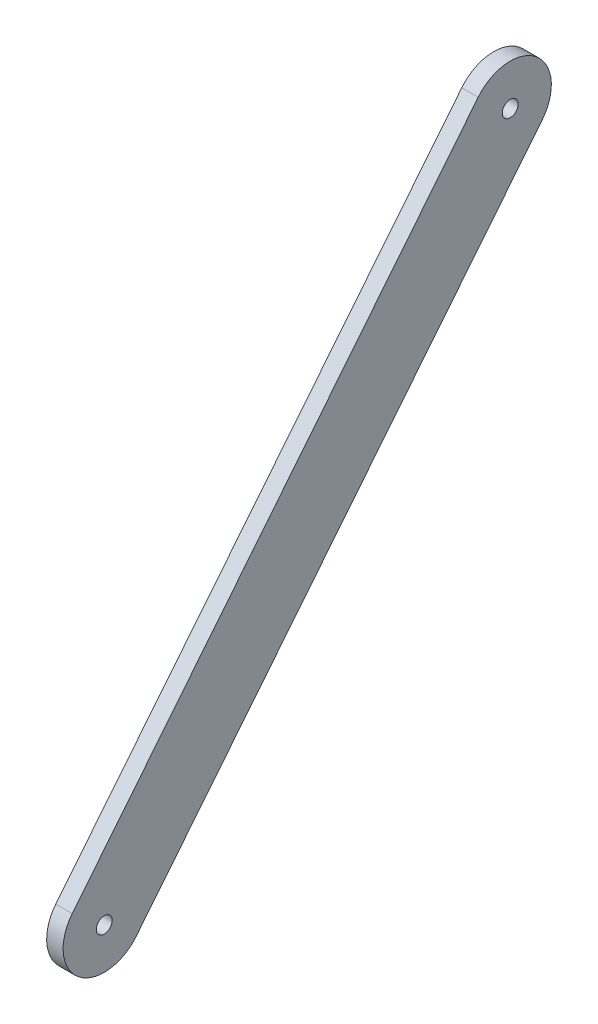
ISO-10303-21;
HEADER;
FILE_DESCRIPTION(('STEP AP214'),'2;1');
FILE_NAME('part.step','',(''),(''),'','','');
FILE_SCHEMA(('AUTOMOTIVE_DESIGN { 1 0 10303 214 1 1 1 1 }'));
ENDSEC;
DATA;
#1=APPLICATION_CONTEXT('core data for automotive mechanical design processes');
#2=APPLICATION_PROTOCOL_DEFINITION('international standard','automotive_design',2000,#1);
#3=PRODUCT_CONTEXT('',#1,'mechanical');
#4=PRODUCT('Part','Part','',(#3));
#5=PRODUCT_RELATED_PRODUCT_CATEGORY('part','',(#4));
#6=PRODUCT_DEFINITION_FORMATION('','',#4);
#7=PRODUCT_DEFINITION_CONTEXT('part definition',#1,'design');
#8=PRODUCT_DEFINITION('design','',#6,#7);
#9=PRODUCT_DEFINITION_SHAPE('','',#8);
#10=(LENGTH_UNIT() NAMED_UNIT(*) SI_UNIT(.MILLI.,.METRE.));
#11=(NAMED_UNIT(*) PLANE_ANGLE_UNIT() SI_UNIT($,.RADIAN.));
#12=(NAMED_UNIT(*) SI_UNIT($,.STERADIAN.) SOLID_ANGLE_UNIT());
#13=UNCERTAINTY_MEASURE_WITH_UNIT(LENGTH_MEASURE(1.E-05),#10,'distance_accuracy_value','');
#14=(GEOMETRIC_REPRESENTATION_CONTEXT(3) GLOBAL_UNCERTAINTY_ASSIGNED_CONTEXT((#13)) GLOBAL_UNIT_ASSIGNED_CONTEXT((#10,
#11,#12)) REPRESENTATION_CONTEXT('',''));
#15=CARTESIAN_POINT('',(0.,0.,0.));
#16=DIRECTION('',(0.,0.,1.));
#17=DIRECTION('',(1.,0.,0.));
#18=AXIS2_PLACEMENT_3D('',#15,#16,#17);
#19=CARTESIAN_POINT('',(0.500000000001009,107.296697475724,101.229246845967));
#20=DIRECTION('',(1.,0.,0.));
#21=DIRECTION('',(0.,0.,-1.));
#22=AXIS2_PLACEMENT_3D('',#19,#20,#21);
#23=CYLINDRICAL_SURFACE('',#22,7.50000000000006);
#24=CARTESIAN_POINT('',(3.50000000000101,107.296697475724,101.229246845967));
#25=DIRECTION('',(-1.,0.,0.));
#26=DIRECTION('',(0.,0.,1.));
#27=AXIS2_PLACEMENT_3D('',#24,#25,#26);
#28=CIRCLE('',#27,7.50000000000006);
#29=CARTESIAN_POINT('',(3.50000000000107,112.001374203466,107.070138634581));
#30=VERTEX_POINT('',#29);
#31=CARTESIAN_POINT('',(3.50000000000095,102.592020747977,95.3883550572829));
#32=VERTEX_POINT('',#31);
#33=EDGE_CURVE('E98',#30,#32,#28,.T.);
#34=ORIENTED_EDGE('',*,*,#33,.T.);
#35=DIRECTION('',(1.,0.,0.));
#36=VECTOR('',#35,1.);
#37=CARTESIAN_POINT('',(0.500000000000951,102.592020747977,95.3883550572829));
#38=LINE('',#37,#36);
#39=CARTESIAN_POINT('',(0.500000000000951,102.592020747977,95.3883550572829));
#40=VERTEX_POINT('',#39);
#41=EDGE_CURVE('E11',#40,#32,#38,.T.);
#42=ORIENTED_EDGE('',*,*,#41,.F.);
#43=CARTESIAN_POINT('',(0.500000000001009,107.296697475724,101.229246845967));
#44=DIRECTION('',(-1.,0.,0.));
#45=DIRECTION('',(0.,0.,1.));
#46=AXIS2_PLACEMENT_3D('',#43,#44,#45);
#47=CIRCLE('',#46,7.50000000000006);
#48=CARTESIAN_POINT('',(0.500000000001067,112.001374203466,107.070138634581));
#49=VERTEX_POINT('',#48);
#50=EDGE_CURVE('E74',#49,#40,#47,.T.);
#51=ORIENTED_EDGE('',*,*,#50,.F.);
#52=DIRECTION('',(1.,0.,0.));
#53=VECTOR('',#52,1.);
#54=CARTESIAN_POINT('',(0.500000000001067,112.001374203466,107.070138634581));
#55=LINE('',#54,#53);
#56=EDGE_CURVE('E49',#49,#30,#55,.T.);
#57=ORIENTED_EDGE('',*,*,#56,.T.);
#58=EDGE_LOOP('',(#34,#42,#51,#57));
#59=FACE_BOUND('',#58,.T.);
#60=ADVANCED_FACE('F33',(#59),#23,.T.);
#61=CARTESIAN_POINT('',(0.499999999850093,18894.1024862471,-15040.6533940874));
#62=DIRECTION('',(0.,-0.627290230365715,-0.778785571828169));
#63=DIRECTION('',(0.,0.778785571828169,-0.627290230365715));
#64=AXIS2_PLACEMENT_3D('',#61,#62,#63);
#65=PLANE('',#64);
#66=DIRECTION('',(0.,0.778785571828169,-0.627290230365715));
#67=VECTOR('',#66,1.);
#68=CARTESIAN_POINT('',(3.49999999985009,18894.1024862471,-15040.6533940874));
#69=LINE('',#68,#67);
#70=CARTESIAN_POINT('',(3.50000000000169,10.6953232722512,169.408602240415));
#71=VERTEX_POINT('',#70);
#72=EDGE_CURVE('E84',#71,#32,#69,.T.);
#73=ORIENTED_EDGE('',*,*,#72,.F.);
#74=DIRECTION('',(1.,0.,0.));
#75=VECTOR('',#74,1.);
#76=CARTESIAN_POINT('',(0.500000000001689,10.6953232722512,169.408602240415));
#77=LINE('',#76,#75);
#78=CARTESIAN_POINT('',(0.500000000001689,10.6953232722512,169.408602240415));
#79=VERTEX_POINT('',#78);
#80=EDGE_CURVE('E41',#79,#71,#77,.T.);
#81=ORIENTED_EDGE('',*,*,#80,.F.);
#82=DIRECTION('',(0.,0.778785571828169,-0.627290230365715));
#83=VECTOR('',#82,1.);
#84=CARTESIAN_POINT('',(0.499999999850093,18894.1024862471,-15040.6533940874));
#85=LINE('',#84,#83);
#86=EDGE_CURVE('E82',#79,#40,#85,.T.);
#87=ORIENTED_EDGE('',*,*,#86,.T.);
#88=ORIENTED_EDGE('',*,*,#41,.T.);
#89=EDGE_LOOP('',(#73,#81,#87,#88));
#90=FACE_BOUND('',#89,.T.);
#91=ADVANCED_FACE('F81',(#90),#65,.T.);
#92=CARTESIAN_POINT('',(0.500000000001747,15.4,175.249494029121));
#93=DIRECTION('',(1.,0.,0.));
#94=DIRECTION('',(0.,0.,-1.));
#95=AXIS2_PLACEMENT_3D('',#92,#93,#94);
#96=CYLINDRICAL_SURFACE('',#95,7.49999999999999);
#97=CARTESIAN_POINT('',(3.50000000000175,15.4,175.249494029121));
#98=DIRECTION('',(-1.,0.,0.));
#99=DIRECTION('',(0.,0.,1.));
#100=AXIS2_PLACEMENT_3D('',#97,#98,#99);
#101=CIRCLE('',#100,7.49999999999999);
#102=CARTESIAN_POINT('',(3.50000000000181,20.1046767277475,181.090385817733));
#103=VERTEX_POINT('',#102);
#104=EDGE_CURVE('E102',#71,#103,#101,.T.);
#105=ORIENTED_EDGE('',*,*,#104,.T.);
#106=DIRECTION('',(1.,0.,0.));
#107=VECTOR('',#106,1.);
#108=CARTESIAN_POINT('',(0.500000000001805,20.1046767277475,181.090385817733));
#109=LINE('',#108,#107);
#110=CARTESIAN_POINT('',(0.500000000001805,20.1046767277475,181.090385817733));
#111=VERTEX_POINT('',#110);
#112=EDGE_CURVE('E63',#111,#103,#109,.T.);
#113=ORIENTED_EDGE('',*,*,#112,.F.);
#114=CARTESIAN_POINT('',(0.500000000001747,15.4,175.249494029121));
#115=DIRECTION('',(-1.,0.,0.));
#116=DIRECTION('',(0.,0.,1.));
#117=AXIS2_PLACEMENT_3D('',#114,#115,#116);
#118=CIRCLE('',#117,7.49999999999999);
#119=EDGE_CURVE('E87',#79,#111,#118,.T.);
#120=ORIENTED_EDGE('',*,*,#119,.F.);
#121=ORIENTED_EDGE('',*,*,#80,.T.);
#122=EDGE_LOOP('',(#105,#113,#120,#121));
#123=FACE_BOUND('',#122,.T.);
#124=ADVANCED_FACE('F88',(#123),#96,.T.);
#125=CARTESIAN_POINT('',(0.49999999985021,18903.5118397021,-15028.9716105097));
#126=DIRECTION('',(0.,0.627290230365714,0.778785571828169));
#127=DIRECTION('',(0.,-0.778785571828169,0.627290230365714));
#128=AXIS2_PLACEMENT_3D('',#125,#126,#127);
#129=PLANE('',#128);
#130=DIRECTION('',(0.,-0.778785571828169,0.627290230365714));
#131=VECTOR('',#130,1.);
#132=CARTESIAN_POINT('',(3.49999999985021,18903.5118397021,-15028.9716105097));
#133=LINE('',#132,#131);
#134=EDGE_CURVE('E93',#30,#103,#133,.T.);
#135=ORIENTED_EDGE('',*,*,#134,.F.);
#136=ORIENTED_EDGE('',*,*,#56,.F.);
#137=DIRECTION('',(0.,-0.778785571828169,0.627290230365714));
#138=VECTOR('',#137,1.);
#139=CARTESIAN_POINT('',(0.49999999985021,18903.5118397021,-15028.9716105097));
#140=LINE('',#139,#138);
#141=EDGE_CURVE('E89',#49,#111,#140,.T.);
#142=ORIENTED_EDGE('',*,*,#141,.T.);
#143=ORIENTED_EDGE('',*,*,#112,.T.);
#144=EDGE_LOOP('',(#135,#136,#142,#143));
#145=FACE_BOUND('',#144,.T.);
#146=ADVANCED_FACE('F109',(#145),#129,.T.);
#147=CARTESIAN_POINT('',(0.500000000001009,107.296697475724,101.229246845967));
#148=DIRECTION('',(-1.,0.,0.));
#149=DIRECTION('',(0.,0.,1.));
#150=AXIS2_PLACEMENT_3D('',#147,#148,#149);
#151=PLANE('',#150);
#152=CARTESIAN_POINT('',(0.500000000000951,107.296697475724,101.229246845967));
#153=DIRECTION('',(1.,0.,0.));
#154=DIRECTION('',(0.,0.,-1.));
#155=AXIS2_PLACEMENT_3D('',#152,#153,#154);
#156=CIRCLE('',#155,1.44999999999999);
#157=CARTESIAN_POINT('',(0.500000000000951,107.296697475724,99.7792468459671));
#158=VERTEX_POINT('',#157);
#159=EDGE_CURVE('E175',#158,#158,#156,.T.);
#160=ORIENTED_EDGE('',*,*,#159,.T.);
#161=EDGE_LOOP('',(#160));
#162=FACE_BOUND('',#161,.T.);
#163=CARTESIAN_POINT('',(0.500000000000951,15.4,175.249494029121));
#164=DIRECTION('',(1.,0.,0.));
#165=DIRECTION('',(0.,0.,-1.));
#166=AXIS2_PLACEMENT_3D('',#163,#164,#165);
#167=CIRCLE('',#166,1.45);
#168=CARTESIAN_POINT('',(0.500000000000951,15.4,173.799494029121));
#169=VERTEX_POINT('',#168);
#170=EDGE_CURVE('E100',#169,#169,#167,.T.);
#171=ORIENTED_EDGE('',*,*,#170,.T.);
#172=EDGE_LOOP('',(#171));
#173=FACE_BOUND('',#172,.T.);
#174=ORIENTED_EDGE('',*,*,#50,.T.);
#175=ORIENTED_EDGE('',*,*,#86,.F.);
#176=ORIENTED_EDGE('',*,*,#119,.T.);
#177=ORIENTED_EDGE('',*,*,#141,.F.);
#178=EDGE_LOOP('',(#174,#175,#176,#177));
#179=FACE_BOUND('',#178,.T.);
#180=ADVANCED_FACE('F91',(#162,#173,#179),#151,.T.);
#181=CARTESIAN_POINT('',(3.50000000000101,107.296697475724,101.229246845967));
#182=DIRECTION('',(-1.,0.,0.));
#183=DIRECTION('',(0.,0.,1.));
#184=AXIS2_PLACEMENT_3D('',#181,#182,#183);
#185=PLANE('',#184);
#186=CARTESIAN_POINT('',(3.5,107.296697475724,101.229246845967));
#187=DIRECTION('',(1.,0.,0.));
#188=DIRECTION('',(0.,0.,-1.));
#189=AXIS2_PLACEMENT_3D('',#186,#187,#188);
#190=CIRCLE('',#189,1.44999999999999);
#191=CARTESIAN_POINT('',(3.5,107.296697475724,99.7792468459671));
#192=VERTEX_POINT('',#191);
#193=EDGE_CURVE('E178',#192,#192,#190,.T.);
#194=ORIENTED_EDGE('',*,*,#193,.F.);
#195=EDGE_LOOP('',(#194));
#196=FACE_BOUND('',#195,.T.);
#197=CARTESIAN_POINT('',(3.5,15.4,175.249494029121));
#198=DIRECTION('',(1.,0.,0.));
#199=DIRECTION('',(0.,0.,-1.));
#200=AXIS2_PLACEMENT_3D('',#197,#198,#199);
#201=CIRCLE('',#200,1.45);
#202=CARTESIAN_POINT('',(3.5,15.4,173.799494029121));
#203=VERTEX_POINT('',#202);
#204=EDGE_CURVE('E180',#203,#203,#201,.T.);
#205=ORIENTED_EDGE('',*,*,#204,.F.);
#206=EDGE_LOOP('',(#205));
#207=FACE_BOUND('',#206,.T.);
#208=ORIENTED_EDGE('',*,*,#33,.F.);
#209=ORIENTED_EDGE('',*,*,#134,.T.);
#210=ORIENTED_EDGE('',*,*,#104,.F.);
#211=ORIENTED_EDGE('',*,*,#72,.T.);
#212=EDGE_LOOP('',(#208,#209,#210,#211));
#213=FACE_BOUND('',#212,.T.);
#214=ADVANCED_FACE('F108',(#196,#207,#213),#185,.F.);
#215=CARTESIAN_POINT('',(3.5,15.4,175.249494029121));
#216=DIRECTION('',(1.,0.,0.));
#217=DIRECTION('',(0.,0.,-1.));
#218=AXIS2_PLACEMENT_3D('',#215,#216,#217);
#219=CYLINDRICAL_SURFACE('',#218,1.45);
#220=ORIENTED_EDGE('',*,*,#170,.F.);
#221=EDGE_LOOP('',(#220));
#222=FACE_BOUND('',#221,.T.);
#223=ORIENTED_EDGE('',*,*,#204,.T.);
#224=EDGE_LOOP('',(#223));
#225=FACE_BOUND('',#224,.T.);
#226=ADVANCED_FACE('F149',(#222,#225),#219,.F.);
#227=CARTESIAN_POINT('',(3.5,107.296697475724,101.229246845967));
#228=DIRECTION('',(1.,0.,0.));
#229=DIRECTION('',(0.,0.,-1.));
#230=AXIS2_PLACEMENT_3D('',#227,#228,#229);
#231=CYLINDRICAL_SURFACE('',#230,1.44999999999999);
#232=ORIENTED_EDGE('',*,*,#159,.F.);
#233=EDGE_LOOP('',(#232));
#234=FACE_BOUND('',#233,.T.);
#235=ORIENTED_EDGE('',*,*,#193,.T.);
#236=EDGE_LOOP('',(#235));
#237=FACE_BOUND('',#236,.T.);
#238=ADVANCED_FACE('F158',(#234,#237),#231,.F.);
#239=CLOSED_SHELL('',(#60,#91,#124,#146,#180,#214,#226,#238));
#240=MANIFOLD_SOLID_BREP('B2',#239);
#241=ADVANCED_BREP_SHAPE_REPRESENTATION('',(#18,#240),#14);
#242=SHAPE_DEFINITION_REPRESENTATION(#9,#241);
ENDSEC;
END-ISO-10303-21;
